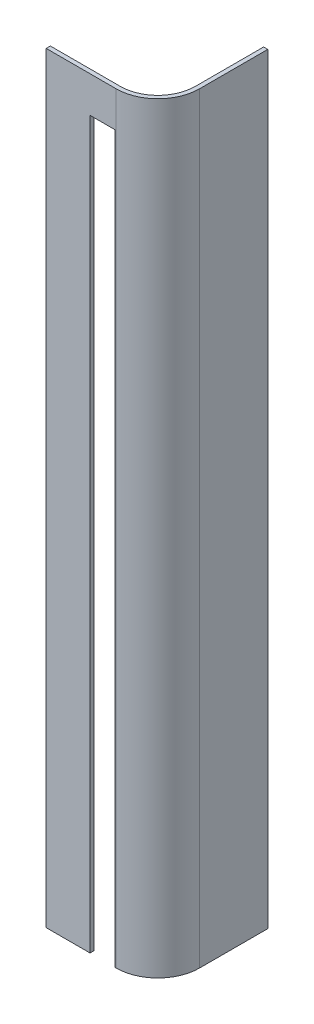
ISO-10303-21;
HEADER;
FILE_DESCRIPTION(('STEP AP214'),'2;1');
FILE_NAME('part.step','',(''),(''),'','','');
FILE_SCHEMA(('AUTOMOTIVE_DESIGN { 1 0 10303 214 1 1 1 1 }'));
ENDSEC;
DATA;
#1=APPLICATION_CONTEXT('core data for automotive mechanical design processes');
#2=APPLICATION_PROTOCOL_DEFINITION('international standard','automotive_design',2000,#1);
#3=PRODUCT_CONTEXT('',#1,'mechanical');
#4=PRODUCT('Part','Part','',(#3));
#5=PRODUCT_RELATED_PRODUCT_CATEGORY('part','',(#4));
#6=PRODUCT_DEFINITION_FORMATION('','',#4);
#7=PRODUCT_DEFINITION_CONTEXT('part definition',#1,'design');
#8=PRODUCT_DEFINITION('design','',#6,#7);
#9=PRODUCT_DEFINITION_SHAPE('','',#8);
#10=(LENGTH_UNIT() NAMED_UNIT(*) SI_UNIT(.MILLI.,.METRE.));
#11=(NAMED_UNIT(*) PLANE_ANGLE_UNIT() SI_UNIT($,.RADIAN.));
#12=(NAMED_UNIT(*) SI_UNIT($,.STERADIAN.) SOLID_ANGLE_UNIT());
#13=UNCERTAINTY_MEASURE_WITH_UNIT(LENGTH_MEASURE(1.E-05),#10,'distance_accuracy_value','');
#14=(GEOMETRIC_REPRESENTATION_CONTEXT(3) GLOBAL_UNCERTAINTY_ASSIGNED_CONTEXT((#13)) GLOBAL_UNIT_ASSIGNED_CONTEXT((#10,
#11,#12)) REPRESENTATION_CONTEXT('',''));
#15=CARTESIAN_POINT('',(0.,0.,0.));
#16=DIRECTION('',(0.,0.,1.));
#17=DIRECTION('',(1.,0.,0.));
#18=AXIS2_PLACEMENT_3D('',#15,#16,#17);
#19=CARTESIAN_POINT('',(-28.3992766438803,-43.2733608722932,-37.9384376588629));
#20=DIRECTION('',(0.,-1.,0.));
#21=DIRECTION('',(0.,0.,-1.));
#22=AXIS2_PLACEMENT_3D('',#19,#20,#21);
#23=PLANE('',#22);
#24=DIRECTION('',(1.,0.,0.));
#25=VECTOR('',#24,1.);
#26=CARTESIAN_POINT('',(0.,-43.2733608722931,-23.1310376588629));
#27=LINE('',#26,#25);
#28=CARTESIAN_POINT('',(-28.3992766438803,-43.2733608722931,-23.1310376588629));
#29=VERTEX_POINT('',#28);
#30=CARTESIAN_POINT('',(1.60072335611968,-43.2733608722931,-23.1310376588629));
#31=VERTEX_POINT('',#30);
#32=EDGE_CURVE('E203',#29,#31,#27,.T.);
#33=ORIENTED_EDGE('',*,*,#32,.F.);
#34=DIRECTION('',(0.,0.,1.));
#35=VECTOR('',#34,1.);
#36=CARTESIAN_POINT('',(-28.3992766438803,-43.2733608722932,-37.9384376588629));
#37=LINE('',#36,#35);
#38=CARTESIAN_POINT('',(-28.3992766438803,-43.2733608722931,-28.131037658863));
#39=VERTEX_POINT('',#38);
#40=EDGE_CURVE('E110',#29,#39,#37,.F.);
#41=ORIENTED_EDGE('',*,*,#40,.T.);
#42=DIRECTION('',(1.,0.,0.));
#43=VECTOR('',#42,1.);
#44=CARTESIAN_POINT('',(0.,-43.2733608722931,-28.131037658863));
#45=LINE('',#44,#43);
#46=CARTESIAN_POINT('',(1.60072335611968,-43.2733608722931,-28.131037658863));
#47=VERTEX_POINT('',#46);
#48=EDGE_CURVE('E120',#39,#47,#45,.T.);
#49=ORIENTED_EDGE('',*,*,#48,.T.);
#50=DIRECTION('',(0.,0.,1.));
#51=VECTOR('',#50,1.);
#52=CARTESIAN_POINT('',(1.60072335611968,-43.2733608722932,-37.9384376588629));
#53=LINE('',#52,#51);
#54=EDGE_CURVE('E228',#31,#47,#53,.F.);
#55=ORIENTED_EDGE('',*,*,#54,.F.);
#56=EDGE_LOOP('',(#33,#41,#49,#55));
#57=FACE_BOUND('',#56,.T.);
#58=ADVANCED_FACE('F17',(#57),#23,.T.);
#59=CARTESIAN_POINT('',(-620.,-914.208524798363,-290.131037658863));
#60=DIRECTION('',(0.,1.,0.));
#61=DIRECTION('',(0.,0.,1.));
#62=AXIS2_PLACEMENT_3D('',#59,#60,#61);
#63=PLANE('',#62);
#64=DIRECTION('',(0.,0.,1.));
#65=VECTOR('',#64,1.);
#66=CARTESIAN_POINT('',(-28.3992766438803,-914.208524798363,-37.9384376588629));
#67=LINE('',#66,#65);
#68=CARTESIAN_POINT('',(-28.3992766438803,-914.208524798363,-28.131037658863));
#69=VERTEX_POINT('',#68);
#70=CARTESIAN_POINT('',(-28.3992766438803,-914.208524798363,-23.1310376588629));
#71=VERTEX_POINT('',#70);
#72=EDGE_CURVE('E239',#69,#71,#67,.T.);
#73=ORIENTED_EDGE('',*,*,#72,.T.);
#74=DIRECTION('',(1.,0.,0.));
#75=VECTOR('',#74,1.);
#76=CARTESIAN_POINT('',(0.,-914.208524798363,-23.1310376588629));
#77=LINE('',#76,#75);
#78=CARTESIAN_POINT('',(-80.9939511690738,-914.208524798363,-23.1310376588629));
#79=VERTEX_POINT('',#78);
#80=EDGE_CURVE('E67',#79,#71,#77,.T.);
#81=ORIENTED_EDGE('',*,*,#80,.F.);
#82=DIRECTION('',(0.,0.,1.));
#83=VECTOR('',#82,1.);
#84=CARTESIAN_POINT('',(-80.9939511690738,-914.208524798363,0.));
#85=LINE('',#84,#83);
#86=CARTESIAN_POINT('',(-80.9939511690738,-914.208524798363,-28.131037658863));
#87=VERTEX_POINT('',#86);
#88=EDGE_CURVE('E195',#87,#79,#85,.T.);
#89=ORIENTED_EDGE('',*,*,#88,.F.);
#90=DIRECTION('',(1.,0.,0.));
#91=VECTOR('',#90,1.);
#92=CARTESIAN_POINT('',(0.,-914.208524798363,-28.131037658863));
#93=LINE('',#92,#91);
#94=EDGE_CURVE('E117',#87,#69,#93,.T.);
#95=ORIENTED_EDGE('',*,*,#94,.T.);
#96=EDGE_LOOP('',(#73,#81,#89,#95));
#97=FACE_BOUND('',#96,.T.);
#98=ADVANCED_FACE('F314',(#97),#63,.F.);
#99=CARTESIAN_POINT('',(-28.3992766438803,-43.2733608722932,-37.9384376588629));
#100=DIRECTION('',(-1.,0.,0.));
#101=DIRECTION('',(0.,-1.,0.));
#102=AXIS2_PLACEMENT_3D('',#99,#100,#101);
#103=PLANE('',#102);
#104=DIRECTION('',(0.,1.,0.));
#105=VECTOR('',#104,1.);
#106=CARTESIAN_POINT('',(-28.3992766438803,-1095.22907456609,-23.1310376588629));
#107=LINE('',#106,#105);
#108=EDGE_CURVE('E225',#71,#29,#107,.T.);
#109=ORIENTED_EDGE('',*,*,#108,.F.);
#110=ORIENTED_EDGE('',*,*,#72,.F.);
#111=DIRECTION('',(0.,1.,0.));
#112=VECTOR('',#111,1.);
#113=CARTESIAN_POINT('',(-28.3992766438803,-1095.22907456609,-28.131037658863));
#114=LINE('',#113,#112);
#115=EDGE_CURVE('E246',#69,#39,#114,.T.);
#116=ORIENTED_EDGE('',*,*,#115,.T.);
#117=ORIENTED_EDGE('',*,*,#40,.F.);
#118=EDGE_LOOP('',(#109,#110,#116,#117));
#119=FACE_BOUND('',#118,.T.);
#120=ADVANCED_FACE('F312',(#119),#103,.F.);
#121=CARTESIAN_POINT('',(0.,-1095.22907456609,-28.131037658863));
#122=DIRECTION('',(0.,0.,1.));
#123=DIRECTION('',(1.,0.,0.));
#124=AXIS2_PLACEMENT_3D('',#121,#122,#123);
#125=PLANE('',#124);
#126=ORIENTED_EDGE('',*,*,#48,.F.);
#127=ORIENTED_EDGE('',*,*,#115,.F.);
#128=ORIENTED_EDGE('',*,*,#94,.F.);
#129=DIRECTION('',(0.,1.,0.));
#130=VECTOR('',#129,1.);
#131=CARTESIAN_POINT('',(-80.9939511690738,0.,-28.131037658863));
#132=LINE('',#131,#130);
#133=CARTESIAN_POINT('',(-80.9939511690738,0.,-28.131037658863));
#134=VERTEX_POINT('',#133);
#135=EDGE_CURVE('E217',#134,#87,#132,.F.);
#136=ORIENTED_EDGE('',*,*,#135,.F.);
#137=DIRECTION('',(1.,0.,0.));
#138=VECTOR('',#137,1.);
#139=CARTESIAN_POINT('',(0.,0.,-28.131037658863));
#140=LINE('',#139,#138);
#141=CARTESIAN_POINT('',(3.,0.,-28.131037658863));
#142=VERTEX_POINT('',#141);
#143=EDGE_CURVE('E187',#142,#134,#140,.F.);
#144=ORIENTED_EDGE('',*,*,#143,.F.);
#145=DIRECTION('',(0.,1.,0.));
#146=VECTOR('',#145,1.);
#147=CARTESIAN_POINT('',(3.,-1095.22907456609,-28.131037658863));
#148=LINE('',#147,#146);
#149=CARTESIAN_POINT('',(3.,-914.208524798363,-28.131037658863));
#150=VERTEX_POINT('',#149);
#151=EDGE_CURVE('E193',#142,#150,#148,.F.);
#152=ORIENTED_EDGE('',*,*,#151,.T.);
#153=DIRECTION('',(1.,0.,0.));
#154=VECTOR('',#153,1.);
#155=CARTESIAN_POINT('',(0.,-914.208524798363,-28.131037658863));
#156=LINE('',#155,#154);
#157=CARTESIAN_POINT('',(1.6007233561197,-914.208524798363,-28.131037658863));
#158=VERTEX_POINT('',#157);
#159=EDGE_CURVE('E100',#158,#150,#156,.T.);
#160=ORIENTED_EDGE('',*,*,#159,.F.);
#161=DIRECTION('',(0.,-1.,0.));
#162=VECTOR('',#161,1.);
#163=CARTESIAN_POINT('',(1.60072335611968,-43.2733608722932,-28.131037658863));
#164=LINE('',#163,#162);
#165=EDGE_CURVE('E196',#47,#158,#164,.T.);
#166=ORIENTED_EDGE('',*,*,#165,.F.);
#167=EDGE_LOOP('',(#126,#127,#128,#136,#144,#152,#160,#166));
#168=FACE_BOUND('',#167,.T.);
#169=ADVANCED_FACE('F269',(#168),#125,.F.);
#170=CARTESIAN_POINT('',(-80.9939511690738,0.,0.));
#171=DIRECTION('',(-1.,0.,0.));
#172=DIRECTION('',(0.,0.,1.));
#173=AXIS2_PLACEMENT_3D('',#170,#171,#172);
#174=PLANE('',#173);
#175=DIRECTION('',(0.,1.,0.));
#176=VECTOR('',#175,1.);
#177=CARTESIAN_POINT('',(-80.9939511690738,-1095.22907456609,-23.1310376588629));
#178=LINE('',#177,#176);
#179=CARTESIAN_POINT('',(-80.9939511690738,0.,-23.1310376588629));
#180=VERTEX_POINT('',#179);
#181=EDGE_CURVE('E202',#180,#79,#178,.F.);
#182=ORIENTED_EDGE('',*,*,#181,.F.);
#183=DIRECTION('',(0.,0.,1.));
#184=VECTOR('',#183,1.);
#185=CARTESIAN_POINT('',(-80.9939511690738,0.,0.));
#186=LINE('',#185,#184);
#187=EDGE_CURVE('E184',#134,#180,#186,.T.);
#188=ORIENTED_EDGE('',*,*,#187,.F.);
#189=ORIENTED_EDGE('',*,*,#135,.T.);
#190=ORIENTED_EDGE('',*,*,#88,.T.);
#191=EDGE_LOOP('',(#182,#188,#189,#190));
#192=FACE_BOUND('',#191,.T.);
#193=ADVANCED_FACE('F274',(#192),#174,.T.);
#194=CARTESIAN_POINT('',(48.,-1095.22907456609,0.));
#195=DIRECTION('',(1.,0.,0.));
#196=DIRECTION('',(0.,0.,-1.));
#197=AXIS2_PLACEMENT_3D('',#194,#195,#196);
#198=PLANE('',#197);
#199=DIRECTION('',(0.,1.,0.));
#200=VECTOR('',#199,1.);
#201=CARTESIAN_POINT('',(48.,0.,-155.131037658863));
#202=LINE('',#201,#200);
#203=CARTESIAN_POINT('',(48.,-914.208524798363,-155.131037658863));
#204=VERTEX_POINT('',#203);
#205=CARTESIAN_POINT('',(48.,0.,-155.131037658863));
#206=VERTEX_POINT('',#205);
#207=EDGE_CURVE('E137',#204,#206,#202,.T.);
#208=ORIENTED_EDGE('',*,*,#207,.F.);
#209=DIRECTION('',(0.,0.,1.));
#210=VECTOR('',#209,1.);
#211=CARTESIAN_POINT('',(48.,-914.208524798363,-290.131037658863));
#212=LINE('',#211,#210);
#213=CARTESIAN_POINT('',(48.,-914.208524798363,-73.1310376588629));
#214=VERTEX_POINT('',#213);
#215=EDGE_CURVE('E140',#204,#214,#212,.T.);
#216=ORIENTED_EDGE('',*,*,#215,.T.);
#217=DIRECTION('',(0.,1.,0.));
#218=VECTOR('',#217,1.);
#219=CARTESIAN_POINT('',(47.9999999999999,-1095.22907456609,-73.1310376588629));
#220=LINE('',#219,#218);
#221=CARTESIAN_POINT('',(48.,0.,-73.1310376588629));
#222=VERTEX_POINT('',#221);
#223=EDGE_CURVE('E56',#214,#222,#220,.T.);
#224=ORIENTED_EDGE('',*,*,#223,.T.);
#225=DIRECTION('',(0.,0.,1.));
#226=VECTOR('',#225,1.);
#227=CARTESIAN_POINT('',(48.,0.,0.));
#228=LINE('',#227,#226);
#229=EDGE_CURVE('E141',#206,#222,#228,.T.);
#230=ORIENTED_EDGE('',*,*,#229,.F.);
#231=EDGE_LOOP('',(#208,#216,#224,#230));
#232=FACE_BOUND('',#231,.T.);
#233=ADVANCED_FACE('F139',(#232),#198,.F.);
#234=CARTESIAN_POINT('',(3.,-1095.22907456609,-73.1310376588629));
#235=DIRECTION('',(0.,1.,0.));
#236=DIRECTION('',(0.,0.,1.));
#237=AXIS2_PLACEMENT_3D('',#234,#235,#236);
#238=CYLINDRICAL_SURFACE('',#237,44.9999999999999);
#239=CARTESIAN_POINT('',(3.,-914.208524798363,-73.1310376588629));
#240=DIRECTION('',(0.,1.,0.));
#241=DIRECTION('',(0.,0.,1.));
#242=AXIS2_PLACEMENT_3D('',#239,#240,#241);
#243=CIRCLE('',#242,44.9999999999999);
#244=EDGE_CURVE('E154',#214,#150,#243,.F.);
#245=ORIENTED_EDGE('',*,*,#244,.T.);
#246=ORIENTED_EDGE('',*,*,#151,.F.);
#247=CARTESIAN_POINT('',(3.,0.,-73.1310376588629));
#248=DIRECTION('',(0.,1.,0.));
#249=DIRECTION('',(0.,0.,1.));
#250=AXIS2_PLACEMENT_3D('',#247,#248,#249);
#251=CIRCLE('',#250,44.9999999999999);
#252=EDGE_CURVE('E20',#222,#142,#251,.F.);
#253=ORIENTED_EDGE('',*,*,#252,.F.);
#254=ORIENTED_EDGE('',*,*,#223,.F.);
#255=EDGE_LOOP('',(#245,#246,#253,#254));
#256=FACE_BOUND('',#255,.T.);
#257=ADVANCED_FACE('F264',(#256),#238,.F.);
#258=CARTESIAN_POINT('',(1.60072335611968,-43.2733608722932,-37.9384376588629));
#259=DIRECTION('',(-1.,0.,0.));
#260=DIRECTION('',(0.,-1.,0.));
#261=AXIS2_PLACEMENT_3D('',#258,#259,#260);
#262=PLANE('',#261);
#263=DIRECTION('',(0.,1.,0.));
#264=VECTOR('',#263,1.);
#265=CARTESIAN_POINT('',(1.60072335611968,-1095.22907456609,-23.1310376588629));
#266=LINE('',#265,#264);
#267=CARTESIAN_POINT('',(1.6007233561197,-914.208524798363,-23.1310376588629));
#268=VERTEX_POINT('',#267);
#269=EDGE_CURVE('E200',#31,#268,#266,.F.);
#270=ORIENTED_EDGE('',*,*,#269,.F.);
#271=ORIENTED_EDGE('',*,*,#54,.T.);
#272=ORIENTED_EDGE('',*,*,#165,.T.);
#273=DIRECTION('',(0.,0.,1.));
#274=VECTOR('',#273,1.);
#275=CARTESIAN_POINT('',(1.60072335611972,-914.208524798363,-290.131037658863));
#276=LINE('',#275,#274);
#277=EDGE_CURVE('E206',#158,#268,#276,.T.);
#278=ORIENTED_EDGE('',*,*,#277,.T.);
#279=EDGE_LOOP('',(#270,#271,#272,#278));
#280=FACE_BOUND('',#279,.T.);
#281=ADVANCED_FACE('F300',(#280),#262,.T.);
#282=CARTESIAN_POINT('',(0.,-1095.22907456609,-23.1310376588629));
#283=DIRECTION('',(0.,0.,1.));
#284=DIRECTION('',(1.,0.,0.));
#285=AXIS2_PLACEMENT_3D('',#282,#283,#284);
#286=PLANE('',#285);
#287=ORIENTED_EDGE('',*,*,#80,.T.);
#288=ORIENTED_EDGE('',*,*,#108,.T.);
#289=ORIENTED_EDGE('',*,*,#32,.T.);
#290=ORIENTED_EDGE('',*,*,#269,.T.);
#291=DIRECTION('',(1.,0.,0.));
#292=VECTOR('',#291,1.);
#293=CARTESIAN_POINT('',(-620.,-914.208524798363,-23.1310376588629));
#294=LINE('',#293,#292);
#295=CARTESIAN_POINT('',(3.,-914.208524798363,-23.1310376588629));
#296=VERTEX_POINT('',#295);
#297=EDGE_CURVE('E94',#268,#296,#294,.T.);
#298=ORIENTED_EDGE('',*,*,#297,.T.);
#299=DIRECTION('',(0.,1.,0.));
#300=VECTOR('',#299,1.);
#301=CARTESIAN_POINT('',(3.,-1095.22907456609,-23.1310376588629));
#302=LINE('',#301,#300);
#303=CARTESIAN_POINT('',(3.,0.,-23.1310376588629));
#304=VERTEX_POINT('',#303);
#305=EDGE_CURVE('E177',#304,#296,#302,.F.);
#306=ORIENTED_EDGE('',*,*,#305,.F.);
#307=DIRECTION('',(1.,0.,0.));
#308=VECTOR('',#307,1.);
#309=CARTESIAN_POINT('',(0.,0.,-23.1310376588629));
#310=LINE('',#309,#308);
#311=EDGE_CURVE('E88',#180,#304,#310,.T.);
#312=ORIENTED_EDGE('',*,*,#311,.F.);
#313=ORIENTED_EDGE('',*,*,#181,.T.);
#314=EDGE_LOOP('',(#287,#288,#289,#290,#298,#306,#312,#313));
#315=FACE_BOUND('',#314,.T.);
#316=ADVANCED_FACE('F275',(#315),#286,.T.);
#317=CARTESIAN_POINT('',(0.,0.,0.));
#318=DIRECTION('',(0.,1.,0.));
#319=DIRECTION('',(0.,0.,1.));
#320=AXIS2_PLACEMENT_3D('',#317,#318,#319);
#321=PLANE('',#320);
#322=DIRECTION('',(-1.,0.,0.));
#323=VECTOR('',#322,1.);
#324=CARTESIAN_POINT('',(0.,0.,-155.131037658863));
#325=LINE('',#324,#323);
#326=CARTESIAN_POINT('',(53.,0.,-155.131037658863));
#327=VERTEX_POINT('',#326);
#328=EDGE_CURVE('E145',#206,#327,#325,.F.);
#329=ORIENTED_EDGE('',*,*,#328,.F.);
#330=ORIENTED_EDGE('',*,*,#229,.T.);
#331=ORIENTED_EDGE('',*,*,#252,.T.);
#332=ORIENTED_EDGE('',*,*,#143,.T.);
#333=ORIENTED_EDGE('',*,*,#187,.T.);
#334=ORIENTED_EDGE('',*,*,#311,.T.);
#335=CARTESIAN_POINT('',(3.,0.,-73.1310376588629));
#336=DIRECTION('',(0.,1.,0.));
#337=DIRECTION('',(0.,0.,1.));
#338=AXIS2_PLACEMENT_3D('',#335,#336,#337);
#339=CIRCLE('',#338,50.);
#340=CARTESIAN_POINT('',(53.,0.,-73.131037658863));
#341=VERTEX_POINT('',#340);
#342=EDGE_CURVE('E192',#341,#304,#339,.F.);
#343=ORIENTED_EDGE('',*,*,#342,.F.);
#344=DIRECTION('',(0.,0.,1.));
#345=VECTOR('',#344,1.);
#346=CARTESIAN_POINT('',(53.,0.,0.));
#347=LINE('',#346,#345);
#348=EDGE_CURVE('E169',#341,#327,#347,.F.);
#349=ORIENTED_EDGE('',*,*,#348,.T.);
#350=EDGE_LOOP('',(#329,#330,#331,#332,#333,#334,#343,#349));
#351=FACE_BOUND('',#350,.T.);
#352=ADVANCED_FACE('F268',(#351),#321,.T.);
#353=CARTESIAN_POINT('',(0.,0.,-155.131037658863));
#354=DIRECTION('',(0.,0.,-1.));
#355=DIRECTION('',(-1.,0.,0.));
#356=AXIS2_PLACEMENT_3D('',#353,#354,#355);
#357=PLANE('',#356);
#358=DIRECTION('',(1.,0.,0.));
#359=VECTOR('',#358,1.);
#360=CARTESIAN_POINT('',(-620.,-914.208524798363,-155.131037658863));
#361=LINE('',#360,#359);
#362=CARTESIAN_POINT('',(53.,-914.208524798363,-155.131037658863));
#363=VERTEX_POINT('',#362);
#364=EDGE_CURVE('E151',#363,#204,#361,.F.);
#365=ORIENTED_EDGE('',*,*,#364,.T.);
#366=ORIENTED_EDGE('',*,*,#207,.T.);
#367=ORIENTED_EDGE('',*,*,#328,.T.);
#368=DIRECTION('',(0.,1.,0.));
#369=VECTOR('',#368,1.);
#370=CARTESIAN_POINT('',(53.,-1095.22907456609,-155.131037658863));
#371=LINE('',#370,#369);
#372=EDGE_CURVE('E159',#327,#363,#371,.F.);
#373=ORIENTED_EDGE('',*,*,#372,.T.);
#374=EDGE_LOOP('',(#365,#366,#367,#373));
#375=FACE_BOUND('',#374,.T.);
#376=ADVANCED_FACE('F157',(#375),#357,.T.);
#377=CARTESIAN_POINT('',(-620.,-914.208524798363,-290.131037658863));
#378=DIRECTION('',(0.,1.,0.));
#379=DIRECTION('',(0.,0.,1.));
#380=AXIS2_PLACEMENT_3D('',#377,#378,#379);
#381=PLANE('',#380);
#382=ORIENTED_EDGE('',*,*,#159,.T.);
#383=ORIENTED_EDGE('',*,*,#244,.F.);
#384=ORIENTED_EDGE('',*,*,#215,.F.);
#385=ORIENTED_EDGE('',*,*,#364,.F.);
#386=DIRECTION('',(0.,0.,1.));
#387=VECTOR('',#386,1.);
#388=CARTESIAN_POINT('',(53.,-914.208524798364,0.));
#389=LINE('',#388,#387);
#390=CARTESIAN_POINT('',(53.,-914.208524798363,-73.131037658863));
#391=VERTEX_POINT('',#390);
#392=EDGE_CURVE('E26',#363,#391,#389,.T.);
#393=ORIENTED_EDGE('',*,*,#392,.T.);
#394=CARTESIAN_POINT('',(3.,-914.208524798363,-73.1310376588629));
#395=DIRECTION('',(0.,1.,0.));
#396=DIRECTION('',(0.,0.,1.));
#397=AXIS2_PLACEMENT_3D('',#394,#395,#396);
#398=CIRCLE('',#397,50.);
#399=EDGE_CURVE('E34',#296,#391,#398,.T.);
#400=ORIENTED_EDGE('',*,*,#399,.F.);
#401=ORIENTED_EDGE('',*,*,#297,.F.);
#402=ORIENTED_EDGE('',*,*,#277,.F.);
#403=EDGE_LOOP('',(#382,#383,#384,#385,#393,#400,#401,#402));
#404=FACE_BOUND('',#403,.T.);
#405=ADVANCED_FACE('F149',(#404),#381,.F.);
#406=CARTESIAN_POINT('',(3.,-1095.22907456609,-73.1310376588629));
#407=DIRECTION('',(0.,1.,0.));
#408=DIRECTION('',(0.,0.,1.));
#409=AXIS2_PLACEMENT_3D('',#406,#407,#408);
#410=CYLINDRICAL_SURFACE('',#409,50.);
#411=ORIENTED_EDGE('',*,*,#342,.T.);
#412=ORIENTED_EDGE('',*,*,#305,.T.);
#413=ORIENTED_EDGE('',*,*,#399,.T.);
#414=DIRECTION('',(0.,1.,0.));
#415=VECTOR('',#414,1.);
#416=CARTESIAN_POINT('',(53.,-1095.22907456609,-73.1310376588629));
#417=LINE('',#416,#415);
#418=EDGE_CURVE('E11',#391,#341,#417,.T.);
#419=ORIENTED_EDGE('',*,*,#418,.T.);
#420=EDGE_LOOP('',(#411,#412,#413,#419));
#421=FACE_BOUND('',#420,.T.);
#422=ADVANCED_FACE('F276',(#421),#410,.T.);
#423=CARTESIAN_POINT('',(53.,-1095.22907456609,0.));
#424=DIRECTION('',(-1.,0.,0.));
#425=DIRECTION('',(0.,0.,1.));
#426=AXIS2_PLACEMENT_3D('',#423,#424,#425);
#427=PLANE('',#426);
#428=ORIENTED_EDGE('',*,*,#392,.F.);
#429=ORIENTED_EDGE('',*,*,#372,.F.);
#430=ORIENTED_EDGE('',*,*,#348,.F.);
#431=ORIENTED_EDGE('',*,*,#418,.F.);
#432=EDGE_LOOP('',(#428,#429,#430,#431));
#433=FACE_BOUND('',#432,.T.);
#434=ADVANCED_FACE('F283',(#433),#427,.F.);
#435=CLOSED_SHELL('',(#58,#98,#120,#169,#193,#233,#257,#281,#316,#352,#376,#405,#422,#434));
#436=MANIFOLD_SOLID_BREP('B1',#435);
#437=ADVANCED_BREP_SHAPE_REPRESENTATION('',(#18,#436),#14);
#438=SHAPE_DEFINITION_REPRESENTATION(#9,#437);
ENDSEC;
END-ISO-10303-21;
